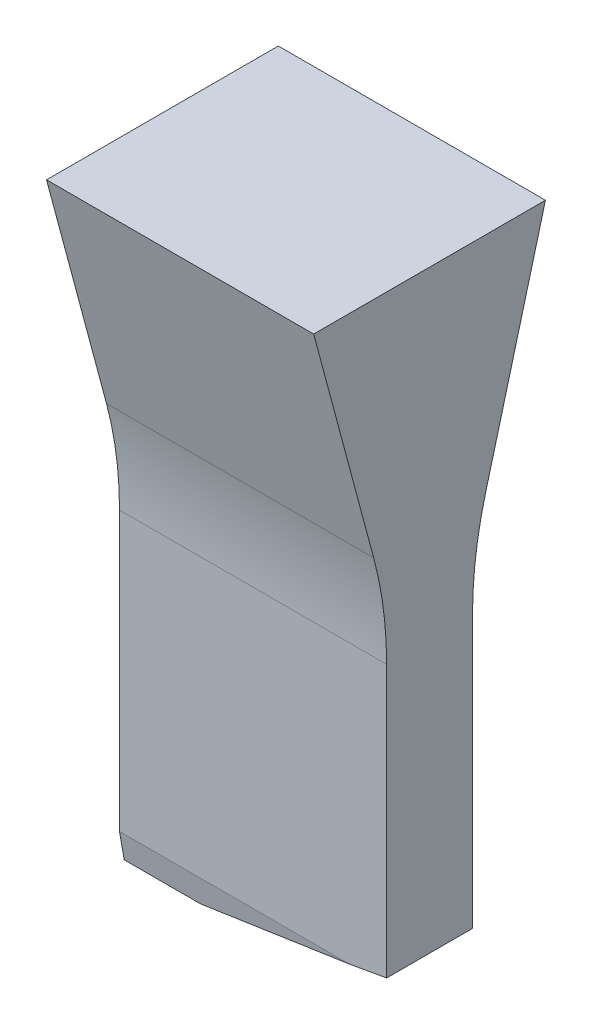
ISO-10303-21;
HEADER;
FILE_DESCRIPTION(('STEP AP214'),'2;1');
FILE_NAME('part.step','',(''),(''),'','','');
FILE_SCHEMA(('AUTOMOTIVE_DESIGN { 1 0 10303 214 1 1 1 1 }'));
ENDSEC;
DATA;
#1=APPLICATION_CONTEXT('core data for automotive mechanical design processes');
#2=APPLICATION_PROTOCOL_DEFINITION('international standard','automotive_design',2000,#1);
#3=PRODUCT_CONTEXT('',#1,'mechanical');
#4=PRODUCT('Part','Part','',(#3));
#5=PRODUCT_RELATED_PRODUCT_CATEGORY('part','',(#4));
#6=PRODUCT_DEFINITION_FORMATION('','',#4);
#7=PRODUCT_DEFINITION_CONTEXT('part definition',#1,'design');
#8=PRODUCT_DEFINITION('design','',#6,#7);
#9=PRODUCT_DEFINITION_SHAPE('','',#8);
#10=(LENGTH_UNIT() NAMED_UNIT(*) SI_UNIT(.MILLI.,.METRE.));
#11=(NAMED_UNIT(*) PLANE_ANGLE_UNIT() SI_UNIT($,.RADIAN.));
#12=(NAMED_UNIT(*) SI_UNIT($,.STERADIAN.) SOLID_ANGLE_UNIT());
#13=UNCERTAINTY_MEASURE_WITH_UNIT(LENGTH_MEASURE(1.E-05),#10,'distance_accuracy_value','');
#14=(GEOMETRIC_REPRESENTATION_CONTEXT(3) GLOBAL_UNCERTAINTY_ASSIGNED_CONTEXT((#13)) GLOBAL_UNIT_ASSIGNED_CONTEXT((#10,
#11,#12)) REPRESENTATION_CONTEXT('',''));
#15=CARTESIAN_POINT('',(0.,0.,0.));
#16=DIRECTION('',(0.,0.,1.));
#17=DIRECTION('',(1.,0.,0.));
#18=AXIS2_PLACEMENT_3D('',#15,#16,#17);
#19=CARTESIAN_POINT('',(-0.37592,21.0312,-0.697645113220181));
#20=DIRECTION('',(1.,0.,0.));
#21=DIRECTION('',(0.,0.,-1.));
#22=AXIS2_PLACEMENT_3D('',#19,#20,#21);
#23=PLANE('',#22);
#24=DIRECTION('',(0.,0.,1.));
#25=VECTOR('',#24,1.);
#26=CARTESIAN_POINT('',(-0.37592,0.835659999999999,-0.697645113220181));
#27=LINE('',#26,#25);
#28=CARTESIAN_POINT('',(-0.37592,0.835659999999992,-0.154249570694659));
#29=VERTEX_POINT('',#28);
#30=CARTESIAN_POINT('',(-0.37592,0.835659999999999,0.15424957069466));
#31=VERTEX_POINT('',#30);
#32=EDGE_CURVE('E57',#29,#31,#27,.T.);
#33=ORIENTED_EDGE('',*,*,#32,.F.);
#34=DIRECTION('',(0.,-0.965925826289068,0.258819045102521));
#35=VECTOR('',#34,1.);
#36=CARTESIAN_POINT('',(-0.375920000000001,19.8142042272038,-5.23953516989227));
#37=LINE('',#36,#35);
#38=CARTESIAN_POINT('',(-0.375920000000002,0.537880074912081,-0.0744596802451533));
#39=VERTEX_POINT('',#38);
#40=EDGE_CURVE('E140',#29,#39,#37,.T.);
#41=ORIENTED_EDGE('',*,*,#40,.T.);
#42=CARTESIAN_POINT('',(-0.375920000000002,0.4064,-0.56515));
#43=DIRECTION('',(1.,0.,0.));
#44=DIRECTION('',(0.,0.,-1.));
#45=AXIS2_PLACEMENT_3D('',#42,#43,#44);
#46=CIRCLE('',#45,0.508);
#47=CARTESIAN_POINT('',(-0.375920000000002,0.4064,-0.05715));
#48=VERTEX_POINT('',#47);
#49=EDGE_CURVE('E181',#39,#48,#46,.T.);
#50=ORIENTED_EDGE('',*,*,#49,.T.);
#51=DIRECTION('',(0.,-1.,0.));
#52=VECTOR('',#51,1.);
#53=CARTESIAN_POINT('',(-0.37592,21.0312,-0.0571499999999972));
#54=LINE('',#53,#52);
#55=CARTESIAN_POINT('',(-0.375919999999998,0.0360126395545731,-0.05715));
#56=VERTEX_POINT('',#55);
#57=EDGE_CURVE('E193',#48,#56,#54,.T.);
#58=ORIENTED_EDGE('',*,*,#57,.T.);
#59=DIRECTION('',(0.,-0.984807753012209,0.173648177666927));
#60=VECTOR('',#59,1.);
#61=CARTESIAN_POINT('',(-0.375920000000001,20.5076487523029,-3.66685178592322));
#62=LINE('',#61,#60);
#63=CARTESIAN_POINT('',(-0.37592,0.,-0.0507999999999996));
#64=VERTEX_POINT('',#63);
#65=EDGE_CURVE('E222',#56,#64,#62,.T.);
#66=ORIENTED_EDGE('',*,*,#65,.T.);
#67=DIRECTION('',(0.,0.,1.));
#68=VECTOR('',#67,1.);
#69=CARTESIAN_POINT('',(-0.37592,0.,-0.697645113220181));
#70=LINE('',#69,#68);
#71=CARTESIAN_POINT('',(-0.375919999999998,0.,0.0508));
#72=VERTEX_POINT('',#71);
#73=EDGE_CURVE('E231',#64,#72,#70,.T.);
#74=ORIENTED_EDGE('',*,*,#73,.T.);
#75=DIRECTION('',(0.,0.984807753012209,0.173648177666927));
#76=VECTOR('',#75,1.);
#77=CARTESIAN_POINT('',(-0.375919999999999,20.2690400706888,3.62477863752339));
#78=LINE('',#77,#76);
#79=CARTESIAN_POINT('',(-0.375919999999998,0.0360126395545731,0.05715));
#80=VERTEX_POINT('',#79);
#81=EDGE_CURVE('E234',#72,#80,#78,.T.);
#82=ORIENTED_EDGE('',*,*,#81,.T.);
#83=DIRECTION('',(0.,1.,0.));
#84=VECTOR('',#83,1.);
#85=CARTESIAN_POINT('',(-0.37592,21.0312,0.0571499999999972));
#86=LINE('',#85,#84);
#87=CARTESIAN_POINT('',(-0.375919999999998,0.4064,0.05715));
#88=VERTEX_POINT('',#87);
#89=EDGE_CURVE('E204',#80,#88,#86,.T.);
#90=ORIENTED_EDGE('',*,*,#89,.T.);
#91=CARTESIAN_POINT('',(-0.375920000000002,0.4064,0.56515));
#92=DIRECTION('',(1.,0.,0.));
#93=DIRECTION('',(0.,0.,-1.));
#94=AXIS2_PLACEMENT_3D('',#91,#92,#93);
#95=CIRCLE('',#94,0.508);
#96=CARTESIAN_POINT('',(-0.375920000000002,0.537880074912081,0.0744596802451533));
#97=VERTEX_POINT('',#96);
#98=EDGE_CURVE('E208',#88,#97,#95,.T.);
#99=ORIENTED_EDGE('',*,*,#98,.T.);
#100=DIRECTION('',(0.,0.965925826289068,0.258819045102521));
#101=VECTOR('',#100,1.);
#102=CARTESIAN_POINT('',(-0.375919999999999,19.4653816705937,5.14606844754684));
#103=LINE('',#102,#101);
#104=EDGE_CURVE('E212',#97,#31,#103,.T.);
#105=ORIENTED_EDGE('',*,*,#104,.T.);
#106=EDGE_LOOP('',(#33,#41,#50,#58,#66,#74,#82,#90,#99,#105));
#107=FACE_BOUND('',#106,.T.);
#108=ADVANCED_FACE('F42',(#107),#23,.F.);
#109=CARTESIAN_POINT('',(26.7468719491216,0.537880074912081,-0.0744596802451533));
#110=DIRECTION('',(0.,0.258819045102521,0.965925826289068));
#111=DIRECTION('',(0.,-0.965925826289068,0.258819045102521));
#112=AXIS2_PLACEMENT_3D('',#109,#110,#111);
#113=PLANE('',#112);
#114=DIRECTION('',(-1.,0.,0.));
#115=VECTOR('',#114,1.);
#116=CARTESIAN_POINT('',(26.7468719491216,0.83566,-0.154249570694662));
#117=LINE('',#116,#115);
#118=CARTESIAN_POINT('',(-0.0203200000000004,0.83566,-0.154249570694661));
#119=VERTEX_POINT('',#118);
#120=EDGE_CURVE('E138',#119,#29,#117,.T.);
#121=ORIENTED_EDGE('',*,*,#120,.F.);
#122=DIRECTION('',(0.,-0.965925826289068,0.258819045102521));
#123=VECTOR('',#122,1.);
#124=CARTESIAN_POINT('',(-0.0203200000000008,0.537880074912081,-0.0744596802451533));
#125=LINE('',#124,#123);
#126=CARTESIAN_POINT('',(-0.0203200000000008,0.537880074912081,-0.0744596802451533));
#127=VERTEX_POINT('',#126);
#128=EDGE_CURVE('E126',#119,#127,#125,.T.);
#129=ORIENTED_EDGE('',*,*,#128,.T.);
#130=DIRECTION('',(-1.,0.,0.));
#131=VECTOR('',#130,1.);
#132=CARTESIAN_POINT('',(26.7468719491216,0.537880074912081,-0.0744596802451533));
#133=LINE('',#132,#131);
#134=EDGE_CURVE('E135',#127,#39,#133,.T.);
#135=ORIENTED_EDGE('',*,*,#134,.T.);
#136=ORIENTED_EDGE('',*,*,#40,.F.);
#137=EDGE_LOOP('',(#121,#129,#135,#136));
#138=FACE_BOUND('',#137,.T.);
#139=ADVANCED_FACE('F139',(#138),#113,.F.);
#140=CARTESIAN_POINT('',(26.7468719491216,0.537880074912081,0.0744596802451533));
#141=DIRECTION('',(0.,0.258819045102521,-0.965925826289068));
#142=DIRECTION('',(0.,0.965925826289068,0.258819045102521));
#143=AXIS2_PLACEMENT_3D('',#140,#141,#142);
#144=PLANE('',#143);
#145=DIRECTION('',(1.,0.,0.));
#146=VECTOR('',#145,1.);
#147=CARTESIAN_POINT('',(26.7468719491216,0.83566,0.154249570694662));
#148=LINE('',#147,#146);
#149=CARTESIAN_POINT('',(-0.0203200000000004,0.83566,0.154249570694661));
#150=VERTEX_POINT('',#149);
#151=EDGE_CURVE('E65',#31,#150,#148,.T.);
#152=ORIENTED_EDGE('',*,*,#151,.F.);
#153=ORIENTED_EDGE('',*,*,#104,.F.);
#154=DIRECTION('',(-1.,0.,0.));
#155=VECTOR('',#154,1.);
#156=CARTESIAN_POINT('',(26.7468719491216,0.537880074912081,0.0744596802451533));
#157=LINE('',#156,#155);
#158=CARTESIAN_POINT('',(-0.0203200000000008,0.537880074912081,0.0744596802451533));
#159=VERTEX_POINT('',#158);
#160=EDGE_CURVE('E176',#159,#97,#157,.T.);
#161=ORIENTED_EDGE('',*,*,#160,.F.);
#162=DIRECTION('',(0.,0.965925826289068,0.258819045102521));
#163=VECTOR('',#162,1.);
#164=CARTESIAN_POINT('',(-0.0203200000000008,0.537880074912081,0.0744596802451533));
#165=LINE('',#164,#163);
#166=EDGE_CURVE('E155',#159,#150,#165,.T.);
#167=ORIENTED_EDGE('',*,*,#166,.T.);
#168=EDGE_LOOP('',(#152,#153,#161,#167));
#169=FACE_BOUND('',#168,.T.);
#170=ADVANCED_FACE('F290',(#169),#144,.F.);
#171=CARTESIAN_POINT('',(-0.02032,0.,26.4754094491216));
#172=DIRECTION('',(-1.,0.,0.));
#173=DIRECTION('',(0.,0.,1.));
#174=AXIS2_PLACEMENT_3D('',#171,#172,#173);
#175=PLANE('',#174);
#176=DIRECTION('',(0.,0.,-1.));
#177=VECTOR('',#176,1.);
#178=CARTESIAN_POINT('',(-0.02032,0.83566,26.4754094491216));
#179=LINE('',#178,#177);
#180=EDGE_CURVE('E12',#150,#119,#179,.T.);
#181=ORIENTED_EDGE('',*,*,#180,.F.);
#182=ORIENTED_EDGE('',*,*,#166,.F.);
#183=CARTESIAN_POINT('',(-0.0203200000000008,0.4064,0.56515));
#184=DIRECTION('',(-1.,0.,0.));
#185=DIRECTION('',(0.,0.,1.));
#186=AXIS2_PLACEMENT_3D('',#183,#184,#185);
#187=CIRCLE('',#186,0.508);
#188=CARTESIAN_POINT('',(-0.0203200000000008,0.4064,0.05715));
#189=VERTEX_POINT('',#188);
#190=EDGE_CURVE('E151',#189,#159,#187,.F.);
#191=ORIENTED_EDGE('',*,*,#190,.F.);
#192=DIRECTION('',(0.,1.,0.));
#193=VECTOR('',#192,1.);
#194=CARTESIAN_POINT('',(-0.0203200000000008,0.,0.05715));
#195=LINE('',#194,#193);
#196=CARTESIAN_POINT('',(-0.0203200000000007,0.0447870530999502,0.0571499999999994));
#197=VERTEX_POINT('',#196);
#198=EDGE_CURVE('E50',#197,#189,#195,.T.);
#199=ORIENTED_EDGE('',*,*,#198,.F.);
#200=DIRECTION('',(0.,0.,1.));
#201=VECTOR('',#200,1.);
#202=CARTESIAN_POINT('',(-0.02032,0.0447870530999503,26.4674719491216));
#203=LINE('',#202,#201);
#204=CARTESIAN_POINT('',(-0.02032,0.0447870530999503,-0.057150000000096));
#205=VERTEX_POINT('',#204);
#206=EDGE_CURVE('E158',#205,#197,#203,.T.);
#207=ORIENTED_EDGE('',*,*,#206,.F.);
#208=DIRECTION('',(0.,-1.,0.));
#209=VECTOR('',#208,1.);
#210=CARTESIAN_POINT('',(-0.0203200000000008,0.,-0.05715));
#211=LINE('',#210,#209);
#212=CARTESIAN_POINT('',(-0.0203200000000008,0.4064,-0.05715));
#213=VERTEX_POINT('',#212);
#214=EDGE_CURVE('E162',#213,#205,#211,.T.);
#215=ORIENTED_EDGE('',*,*,#214,.F.);
#216=CARTESIAN_POINT('',(-0.0203200000000008,0.4064,-0.56515));
#217=DIRECTION('',(-1.,0.,0.));
#218=DIRECTION('',(0.,0.,1.));
#219=AXIS2_PLACEMENT_3D('',#216,#217,#218);
#220=CIRCLE('',#219,0.508);
#221=EDGE_CURVE('E130',#127,#213,#220,.F.);
#222=ORIENTED_EDGE('',*,*,#221,.F.);
#223=ORIENTED_EDGE('',*,*,#128,.F.);
#224=EDGE_LOOP('',(#181,#182,#191,#199,#207,#215,#222,#223));
#225=FACE_BOUND('',#224,.T.);
#226=ADVANCED_FACE('F128',(#225),#175,.F.);
#227=CARTESIAN_POINT('',(26.8738719491216,0.,-0.0508));
#228=DIRECTION('',(0.,0.173648177666927,0.984807753012208));
#229=DIRECTION('',(0.,-0.984807753012209,0.173648177666927));
#230=AXIS2_PLACEMENT_3D('',#227,#228,#229);
#231=PLANE('',#230);
#232=ORIENTED_EDGE('',*,*,#65,.F.);
#233=DIRECTION('',(1.,0.,0.));
#234=VECTOR('',#233,1.);
#235=CARTESIAN_POINT('',(26.8738719491216,0.0360126395545731,-0.05715));
#236=LINE('',#235,#234);
#237=CARTESIAN_POINT('',(-0.0700821720115049,0.036012639555666,-0.0571500000000959));
#238=VERTEX_POINT('',#237);
#239=EDGE_CURVE('E189',#56,#238,#236,.T.);
#240=ORIENTED_EDGE('',*,*,#239,.T.);
#241=DIRECTION('',(-0.984346441568213,-0.173566836012845,0.0306045161452657));
#242=VECTOR('',#241,1.);
#243=CARTESIAN_POINT('',(26.0305925582583,4.63826580919789,-0.868651405859155));
#244=LINE('',#243,#242);
#245=CARTESIAN_POINT('',(-0.274320000000001,0.,-0.0508000000000018));
#246=VERTEX_POINT('',#245);
#247=EDGE_CURVE('E219',#238,#246,#244,.T.);
#248=ORIENTED_EDGE('',*,*,#247,.T.);
#249=DIRECTION('',(-1.,0.,0.));
#250=VECTOR('',#249,1.);
#251=CARTESIAN_POINT('',(26.8738719491216,0.,-0.0508));
#252=LINE('',#251,#250);
#253=EDGE_CURVE('E223',#246,#64,#252,.T.);
#254=ORIENTED_EDGE('',*,*,#253,.T.);
#255=EDGE_LOOP('',(#232,#240,#248,#254));
#256=FACE_BOUND('',#255,.T.);
#257=ADVANCED_FACE('F269',(#256),#231,.F.);
#258=CARTESIAN_POINT('',(0.,0.,0.));
#259=DIRECTION('',(0.,1.,0.));
#260=DIRECTION('',(0.,0.,1.));
#261=AXIS2_PLACEMENT_3D('',#258,#259,#260);
#262=PLANE('',#261);
#263=DIRECTION('',(0.,0.,-1.));
#264=VECTOR('',#263,1.);
#265=CARTESIAN_POINT('',(-0.27432,0.,26.4674719491216));
#266=LINE('',#265,#264);
#267=CARTESIAN_POINT('',(-0.274320000000001,0.,0.0508000000000001));
#268=VERTEX_POINT('',#267);
#269=EDGE_CURVE('E215',#268,#246,#266,.T.);
#270=ORIENTED_EDGE('',*,*,#269,.F.);
#271=DIRECTION('',(-1.,0.,0.));
#272=VECTOR('',#271,1.);
#273=CARTESIAN_POINT('',(26.8738719491216,0.,0.0508));
#274=LINE('',#273,#272);
#275=EDGE_CURVE('E228',#268,#72,#274,.T.);
#276=ORIENTED_EDGE('',*,*,#275,.T.);
#277=ORIENTED_EDGE('',*,*,#73,.F.);
#278=ORIENTED_EDGE('',*,*,#253,.F.);
#279=EDGE_LOOP('',(#270,#276,#277,#278));
#280=FACE_BOUND('',#279,.T.);
#281=ADVANCED_FACE('F265',(#280),#262,.F.);
#282=CARTESIAN_POINT('',(26.8738719491216,0.,0.0508));
#283=DIRECTION('',(0.,0.173648177666927,-0.984807753012208));
#284=DIRECTION('',(0.,0.984807753012209,0.173648177666927));
#285=AXIS2_PLACEMENT_3D('',#282,#283,#284);
#286=PLANE('',#285);
#287=DIRECTION('',(0.984346441568213,0.173566836012845,0.0306045161452657));
#288=VECTOR('',#287,1.);
#289=CARTESIAN_POINT('',(26.0305925582583,4.63826580919789,0.868651405859155));
#290=LINE('',#289,#288);
#291=CARTESIAN_POINT('',(-0.0700821720115049,0.036012639555666,0.0571500000000959));
#292=VERTEX_POINT('',#291);
#293=EDGE_CURVE('E227',#268,#292,#290,.T.);
#294=ORIENTED_EDGE('',*,*,#293,.T.);
#295=DIRECTION('',(-1.,0.,0.));
#296=VECTOR('',#295,1.);
#297=CARTESIAN_POINT('',(26.8738719491216,0.0360126395545731,0.05715));
#298=LINE('',#297,#296);
#299=EDGE_CURVE('E200',#292,#80,#298,.T.);
#300=ORIENTED_EDGE('',*,*,#299,.T.);
#301=ORIENTED_EDGE('',*,*,#81,.F.);
#302=ORIENTED_EDGE('',*,*,#275,.F.);
#303=EDGE_LOOP('',(#294,#300,#301,#302));
#304=FACE_BOUND('',#303,.T.);
#305=ADVANCED_FACE('F257',(#304),#286,.F.);
#306=CARTESIAN_POINT('',(-0.27432,0.,26.4674719491216));
#307=DIRECTION('',(-0.173648177666931,0.984807753012208,0.));
#308=DIRECTION('',(-0.984807753012208,-0.173648177666931,0.));
#309=AXIS2_PLACEMENT_3D('',#306,#307,#308);
#310=PLANE('',#309);
#311=DIRECTION('',(0.984807753012208,0.173648177666931,0.));
#312=VECTOR('',#311,1.);
#313=CARTESIAN_POINT('',(-0.274319999999999,0.,-0.0571499999999989));
#314=LINE('',#313,#312);
#315=EDGE_CURVE('E185',#238,#205,#314,.T.);
#316=ORIENTED_EDGE('',*,*,#315,.T.);
#317=ORIENTED_EDGE('',*,*,#206,.T.);
#318=DIRECTION('',(-0.984807753012208,-0.173648177666931,0.));
#319=VECTOR('',#318,1.);
#320=CARTESIAN_POINT('',(-0.274320000000001,0.,0.0571499999999989));
#321=LINE('',#320,#319);
#322=EDGE_CURVE('E197',#197,#292,#321,.T.);
#323=ORIENTED_EDGE('',*,*,#322,.T.);
#324=ORIENTED_EDGE('',*,*,#293,.F.);
#325=ORIENTED_EDGE('',*,*,#269,.T.);
#326=ORIENTED_EDGE('',*,*,#247,.F.);
#327=EDGE_LOOP('',(#316,#317,#323,#324,#325,#326));
#328=FACE_BOUND('',#327,.T.);
#329=ADVANCED_FACE('F261',(#328),#310,.F.);
#330=CARTESIAN_POINT('',(26.7468719491216,0.4064,-0.56515));
#331=DIRECTION('',(-1.,0.,0.));
#332=DIRECTION('',(0.,0.,1.));
#333=AXIS2_PLACEMENT_3D('',#330,#331,#332);
#334=CYLINDRICAL_SURFACE('',#333,0.508);
#335=ORIENTED_EDGE('',*,*,#134,.F.);
#336=ORIENTED_EDGE('',*,*,#221,.T.);
#337=DIRECTION('',(-1.,0.,0.));
#338=VECTOR('',#337,1.);
#339=CARTESIAN_POINT('',(26.7468719491216,0.4064,-0.05715));
#340=LINE('',#339,#338);
#341=EDGE_CURVE('E170',#213,#48,#340,.T.);
#342=ORIENTED_EDGE('',*,*,#341,.T.);
#343=ORIENTED_EDGE('',*,*,#49,.F.);
#344=EDGE_LOOP('',(#335,#336,#342,#343));
#345=FACE_BOUND('',#344,.T.);
#346=ADVANCED_FACE('F275',(#345),#334,.F.);
#347=CARTESIAN_POINT('',(26.7468719491216,0.,-0.05715));
#348=DIRECTION('',(0.,0.,1.));
#349=DIRECTION('',(0.,-1.,0.));
#350=AXIS2_PLACEMENT_3D('',#347,#348,#349);
#351=PLANE('',#350);
#352=ORIENTED_EDGE('',*,*,#341,.F.);
#353=ORIENTED_EDGE('',*,*,#214,.T.);
#354=ORIENTED_EDGE('',*,*,#315,.F.);
#355=ORIENTED_EDGE('',*,*,#239,.F.);
#356=ORIENTED_EDGE('',*,*,#57,.F.);
#357=EDGE_LOOP('',(#352,#353,#354,#355,#356));
#358=FACE_BOUND('',#357,.T.);
#359=ADVANCED_FACE('F272',(#358),#351,.F.);
#360=CARTESIAN_POINT('',(26.7468719491216,0.4064,0.56515));
#361=DIRECTION('',(-1.,0.,0.));
#362=DIRECTION('',(0.,0.,1.));
#363=AXIS2_PLACEMENT_3D('',#360,#361,#362);
#364=CYLINDRICAL_SURFACE('',#363,0.508);
#365=DIRECTION('',(-1.,0.,0.));
#366=VECTOR('',#365,1.);
#367=CARTESIAN_POINT('',(26.7468719491216,0.4064,0.05715));
#368=LINE('',#367,#366);
#369=EDGE_CURVE('E173',#189,#88,#368,.T.);
#370=ORIENTED_EDGE('',*,*,#369,.F.);
#371=ORIENTED_EDGE('',*,*,#190,.T.);
#372=ORIENTED_EDGE('',*,*,#160,.T.);
#373=ORIENTED_EDGE('',*,*,#98,.F.);
#374=EDGE_LOOP('',(#370,#371,#372,#373));
#375=FACE_BOUND('',#374,.T.);
#376=ADVANCED_FACE('F253',(#375),#364,.F.);
#377=CARTESIAN_POINT('',(26.7468719491216,0.,0.05715));
#378=DIRECTION('',(0.,0.,-1.));
#379=DIRECTION('',(0.,1.,0.));
#380=AXIS2_PLACEMENT_3D('',#377,#378,#379);
#381=PLANE('',#380);
#382=ORIENTED_EDGE('',*,*,#322,.F.);
#383=ORIENTED_EDGE('',*,*,#198,.T.);
#384=ORIENTED_EDGE('',*,*,#369,.T.);
#385=ORIENTED_EDGE('',*,*,#89,.F.);
#386=ORIENTED_EDGE('',*,*,#299,.F.);
#387=EDGE_LOOP('',(#382,#383,#384,#385,#386));
#388=FACE_BOUND('',#387,.T.);
#389=ADVANCED_FACE('F249',(#388),#381,.F.);
#390=CARTESIAN_POINT('',(0.,0.83566,0.));
#391=DIRECTION('',(0.,1.,0.));
#392=DIRECTION('',(0.,0.,1.));
#393=AXIS2_PLACEMENT_3D('',#390,#391,#392);
#394=PLANE('',#393);
#395=ORIENTED_EDGE('',*,*,#120,.T.);
#396=ORIENTED_EDGE('',*,*,#32,.T.);
#397=ORIENTED_EDGE('',*,*,#151,.T.);
#398=ORIENTED_EDGE('',*,*,#180,.T.);
#399=EDGE_LOOP('',(#395,#396,#397,#398));
#400=FACE_BOUND('',#399,.T.);
#401=ADVANCED_FACE('F144',(#400),#394,.T.);
#402=CLOSED_SHELL('',(#108,#139,#170,#226,#257,#281,#305,#329,#346,#359,#376,#389,#401));
#403=MANIFOLD_SOLID_BREP('B2',#402);
#404=ADVANCED_BREP_SHAPE_REPRESENTATION('',(#18,#403),#14);
#405=SHAPE_DEFINITION_REPRESENTATION(#9,#404);
ENDSEC;
END-ISO-10303-21;
